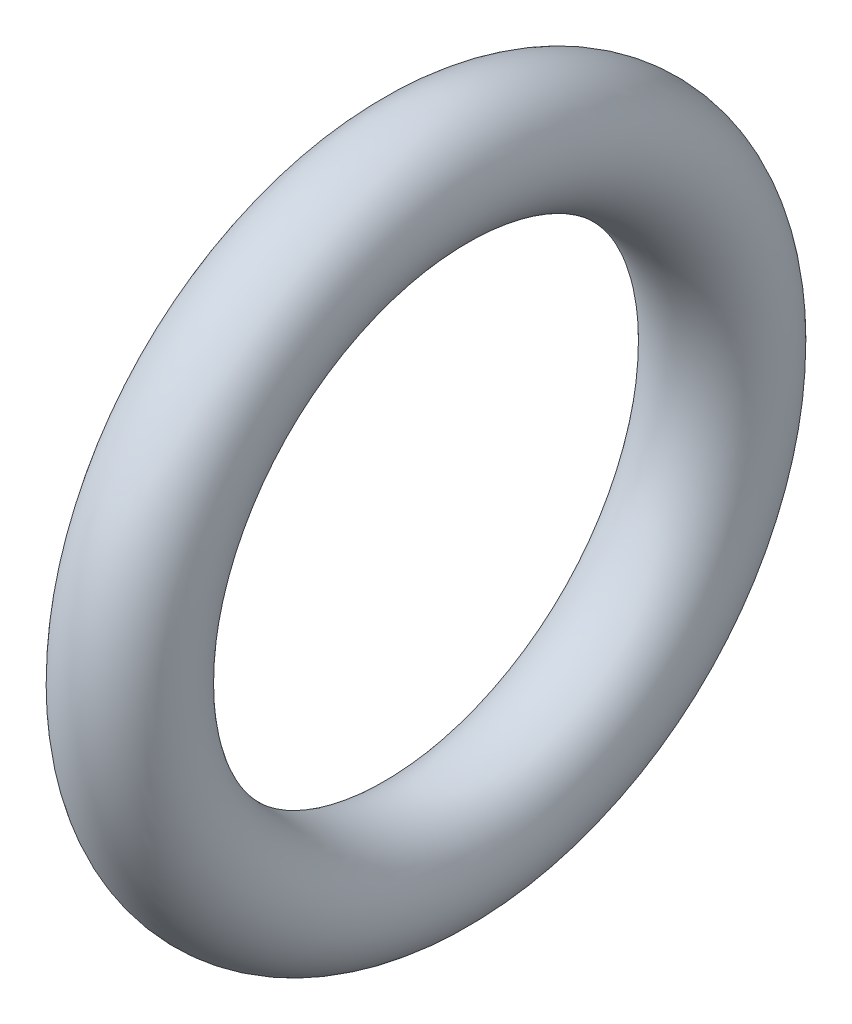
ISO-10303-21;
HEADER;
FILE_DESCRIPTION(('STEP AP214'),'2;1');
FILE_NAME('part.step','',(''),(''),'','','');
FILE_SCHEMA(('AUTOMOTIVE_DESIGN { 1 0 10303 214 1 1 1 1 }'));
ENDSEC;
DATA;
#1=APPLICATION_CONTEXT('core data for automotive mechanical design processes');
#2=APPLICATION_PROTOCOL_DEFINITION('international standard','automotive_design',2000,#1);
#3=PRODUCT_CONTEXT('',#1,'mechanical');
#4=PRODUCT('Part','Part','',(#3));
#5=PRODUCT_RELATED_PRODUCT_CATEGORY('part','',(#4));
#6=PRODUCT_DEFINITION_FORMATION('','',#4);
#7=PRODUCT_DEFINITION_CONTEXT('part definition',#1,'design');
#8=PRODUCT_DEFINITION('design','',#6,#7);
#9=PRODUCT_DEFINITION_SHAPE('','',#8);
#10=(LENGTH_UNIT() NAMED_UNIT(*) SI_UNIT(.MILLI.,.METRE.));
#11=(NAMED_UNIT(*) PLANE_ANGLE_UNIT() SI_UNIT($,.RADIAN.));
#12=(NAMED_UNIT(*) SI_UNIT($,.STERADIAN.) SOLID_ANGLE_UNIT());
#13=UNCERTAINTY_MEASURE_WITH_UNIT(LENGTH_MEASURE(1.E-05),#10,'distance_accuracy_value','');
#14=(GEOMETRIC_REPRESENTATION_CONTEXT(3) GLOBAL_UNCERTAINTY_ASSIGNED_CONTEXT((#13)) GLOBAL_UNIT_ASSIGNED_CONTEXT((#10,
#11,#12)) REPRESENTATION_CONTEXT('',''));
#15=CARTESIAN_POINT('',(0.,0.,0.));
#16=DIRECTION('',(0.,0.,1.));
#17=DIRECTION('',(1.,0.,0.));
#18=AXIS2_PLACEMENT_3D('',#15,#16,#17);
#19=CARTESIAN_POINT('',(0.,0.,0.));
#20=DIRECTION('',(-1.,0.,0.));
#21=DIRECTION('',(0.,0.,1.));
#22=AXIS2_PLACEMENT_3D('',#19,#20,#21);
#23=TOROIDAL_SURFACE('',#22,5.,1.);
#24=CARTESIAN_POINT('',(0.,0.,6.));
#25=VERTEX_POINT('',#24);
#26=VERTEX_LOOP('',#25);
#27=FACE_BOUND('',#26,.T.);
#28=ADVANCED_FACE('F38',(#27),#23,.T.);
#29=CLOSED_SHELL('',(#28));
#30=MANIFOLD_SOLID_BREP('B2',#29);
#31=ADVANCED_BREP_SHAPE_REPRESENTATION('',(#18,#30),#14);
#32=SHAPE_DEFINITION_REPRESENTATION(#9,#31);
ENDSEC;
END-ISO-10303-21;
